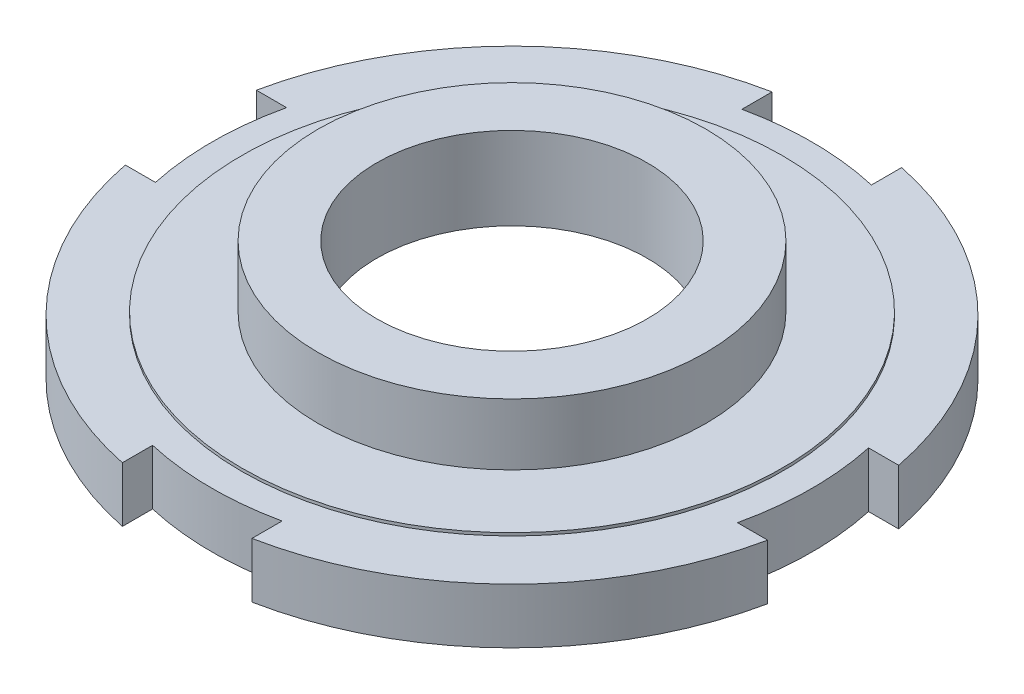
ISO-10303-21;
HEADER;
FILE_DESCRIPTION(('STEP AP214'),'2;1');
FILE_NAME('part.step','',(''),(''),'','','');
FILE_SCHEMA(('AUTOMOTIVE_DESIGN { 1 0 10303 214 1 1 1 1 }'));
ENDSEC;
DATA;
#1=APPLICATION_CONTEXT('core data for automotive mechanical design processes');
#2=APPLICATION_PROTOCOL_DEFINITION('international standard','automotive_design',2000,#1);
#3=PRODUCT_CONTEXT('',#1,'mechanical');
#4=PRODUCT('Part','Part','',(#3));
#5=PRODUCT_RELATED_PRODUCT_CATEGORY('part','',(#4));
#6=PRODUCT_DEFINITION_FORMATION('','',#4);
#7=PRODUCT_DEFINITION_CONTEXT('part definition',#1,'design');
#8=PRODUCT_DEFINITION('design','',#6,#7);
#9=PRODUCT_DEFINITION_SHAPE('','',#8);
#10=(LENGTH_UNIT() NAMED_UNIT(*) SI_UNIT(.MILLI.,.METRE.));
#11=(NAMED_UNIT(*) PLANE_ANGLE_UNIT() SI_UNIT($,.RADIAN.));
#12=(NAMED_UNIT(*) SI_UNIT($,.STERADIAN.) SOLID_ANGLE_UNIT());
#13=UNCERTAINTY_MEASURE_WITH_UNIT(LENGTH_MEASURE(1.E-05),#10,'distance_accuracy_value','');
#14=(GEOMETRIC_REPRESENTATION_CONTEXT(3) GLOBAL_UNCERTAINTY_ASSIGNED_CONTEXT((#13)) GLOBAL_UNIT_ASSIGNED_CONTEXT((#10,
#11,#12)) REPRESENTATION_CONTEXT('',''));
#15=CARTESIAN_POINT('',(0.,0.,0.));
#16=DIRECTION('',(0.,0.,1.));
#17=DIRECTION('',(1.,0.,0.));
#18=AXIS2_PLACEMENT_3D('',#15,#16,#17);
#19=CARTESIAN_POINT('',(0.,6.0000007,0.));
#20=DIRECTION('',(0.,1.,0.));
#21=DIRECTION('',(0.,0.,1.));
#22=AXIS2_PLACEMENT_3D('',#19,#20,#21);
#23=PLANE('',#22);
#24=CARTESIAN_POINT('',(0.,6.0000007,0.));
#25=DIRECTION('',(0.,1.,0.));
#26=DIRECTION('',(0.,0.,1.));
#27=AXIS2_PLACEMENT_3D('',#24,#25,#26);
#28=CIRCLE('',#27,20.01);
#29=CARTESIAN_POINT('',(0.,6.0000007,20.01));
#30=VERTEX_POINT('',#29);
#31=EDGE_CURVE('E346',#30,#30,#28,.T.);
#32=ORIENTED_EDGE('',*,*,#31,.F.);
#33=EDGE_LOOP('',(#32));
#34=FACE_BOUND('',#33,.T.);
#35=CARTESIAN_POINT('',(0.,6.0000007,0.));
#36=DIRECTION('',(0.,1.,0.));
#37=DIRECTION('',(0.,0.,1.));
#38=AXIS2_PLACEMENT_3D('',#35,#36,#37);
#39=CIRCLE('',#38,27.94);
#40=CARTESIAN_POINT('',(0.,6.0000007,27.94));
#41=VERTEX_POINT('',#40);
#42=EDGE_CURVE('E406',#41,#41,#39,.T.);
#43=ORIENTED_EDGE('',*,*,#42,.T.);
#44=EDGE_LOOP('',(#43));
#45=FACE_BOUND('',#44,.T.);
#46=ADVANCED_FACE('F36',(#34,#45),#23,.T.);
#47=CARTESIAN_POINT('',(0.,6.0000007,0.));
#48=DIRECTION('',(0.,-1.,0.));
#49=DIRECTION('',(0.,0.,-1.));
#50=AXIS2_PLACEMENT_3D('',#47,#48,#49);
#51=CYLINDRICAL_SURFACE('',#50,30.988);
#52=CARTESIAN_POINT('',(0.,5.7000007,0.));
#53=DIRECTION('',(0.,1.,0.));
#54=DIRECTION('',(0.,0.,1.));
#55=AXIS2_PLACEMENT_3D('',#52,#53,#54);
#56=CIRCLE('',#55,30.988);
#57=CARTESIAN_POINT('',(30.2051151586946,5.7000007,6.9215));
#58=VERTEX_POINT('',#57);
#59=CARTESIAN_POINT('',(30.2898993684363,5.7000007,-6.5405));
#60=VERTEX_POINT('',#59);
#61=EDGE_CURVE('E184',#58,#60,#56,.T.);
#62=ORIENTED_EDGE('',*,*,#61,.F.);
#63=DIRECTION('',(0.,-1.,0.));
#64=VECTOR('',#63,1.);
#65=CARTESIAN_POINT('',(30.2051151586946,6.0000007,6.9215));
#66=LINE('',#65,#64);
#67=CARTESIAN_POINT('',(30.2051151586946,0.,6.9215));
#68=VERTEX_POINT('',#67);
#69=EDGE_CURVE('E192',#58,#68,#66,.T.);
#70=ORIENTED_EDGE('',*,*,#69,.T.);
#71=CARTESIAN_POINT('',(0.,0.,0.));
#72=DIRECTION('',(0.,1.,0.));
#73=DIRECTION('',(0.,0.,1.));
#74=AXIS2_PLACEMENT_3D('',#71,#72,#73);
#75=CIRCLE('',#74,30.988);
#76=CARTESIAN_POINT('',(30.2898993684363,0.,-6.5405));
#77=VERTEX_POINT('',#76);
#78=EDGE_CURVE('E285',#68,#77,#75,.T.);
#79=ORIENTED_EDGE('',*,*,#78,.T.);
#80=DIRECTION('',(0.,-1.,0.));
#81=VECTOR('',#80,1.);
#82=CARTESIAN_POINT('',(30.2898993684363,6.0000007,-6.5405));
#83=LINE('',#82,#81);
#84=EDGE_CURVE('E194',#60,#77,#83,.T.);
#85=ORIENTED_EDGE('',*,*,#84,.F.);
#86=EDGE_LOOP('',(#62,#70,#79,#85));
#87=FACE_BOUND('',#86,.T.);
#88=ADVANCED_FACE('F38',(#87),#51,.T.);
#89=CARTESIAN_POINT('',(30.2898993684363,6.0000007,-6.5405));
#90=DIRECTION('',(0.,0.,-1.));
#91=DIRECTION('',(-1.,0.,0.));
#92=AXIS2_PLACEMENT_3D('',#89,#90,#91);
#93=PLANE('',#92);
#94=DIRECTION('',(1.,0.,0.));
#95=VECTOR('',#94,1.);
#96=CARTESIAN_POINT('',(30.2898993684363,5.7000007,-6.5405));
#97=LINE('',#96,#95);
#98=CARTESIAN_POINT('',(33.4016639667847,5.7000007,-6.5405));
#99=VERTEX_POINT('',#98);
#100=EDGE_CURVE('E196',#60,#99,#97,.T.);
#101=ORIENTED_EDGE('',*,*,#100,.F.);
#102=ORIENTED_EDGE('',*,*,#84,.T.);
#103=DIRECTION('',(1.,0.,0.));
#104=VECTOR('',#103,1.);
#105=CARTESIAN_POINT('',(30.2898993684363,0.,-6.5405));
#106=LINE('',#105,#104);
#107=CARTESIAN_POINT('',(33.4016639667847,0.,-6.5405));
#108=VERTEX_POINT('',#107);
#109=EDGE_CURVE('E287',#77,#108,#106,.T.);
#110=ORIENTED_EDGE('',*,*,#109,.T.);
#111=DIRECTION('',(0.,-1.,0.));
#112=VECTOR('',#111,1.);
#113=CARTESIAN_POINT('',(33.4016639667847,6.0000007,-6.5405));
#114=LINE('',#113,#112);
#115=EDGE_CURVE('E233',#99,#108,#114,.T.);
#116=ORIENTED_EDGE('',*,*,#115,.F.);
#117=EDGE_LOOP('',(#101,#102,#110,#116));
#118=FACE_BOUND('',#117,.T.);
#119=ADVANCED_FACE('F336',(#118),#93,.F.);
#120=CARTESIAN_POINT('',(0.,6.0000007,0.));
#121=DIRECTION('',(0.,-1.,0.));
#122=DIRECTION('',(0.,0.,-1.));
#123=AXIS2_PLACEMENT_3D('',#120,#121,#122);
#124=CYLINDRICAL_SURFACE('',#123,34.036);
#125=CARTESIAN_POINT('',(0.,5.7000007,0.));
#126=DIRECTION('',(0.,1.,0.));
#127=DIRECTION('',(0.,0.,1.));
#128=AXIS2_PLACEMENT_3D('',#125,#126,#127);
#129=CIRCLE('',#128,34.036);
#130=CARTESIAN_POINT('',(6.92149999999999,5.7000007,-33.3247975800304));
#131=VERTEX_POINT('',#130);
#132=EDGE_CURVE('E338',#99,#131,#129,.T.);
#133=ORIENTED_EDGE('',*,*,#132,.F.);
#134=ORIENTED_EDGE('',*,*,#115,.T.);
#135=CARTESIAN_POINT('',(0.,0.,0.));
#136=DIRECTION('',(0.,1.,0.));
#137=DIRECTION('',(0.,0.,1.));
#138=AXIS2_PLACEMENT_3D('',#135,#136,#137);
#139=CIRCLE('',#138,34.036);
#140=CARTESIAN_POINT('',(6.92149999999999,0.,-33.3247975800304));
#141=VERTEX_POINT('',#140);
#142=EDGE_CURVE('E290',#108,#141,#139,.T.);
#143=ORIENTED_EDGE('',*,*,#142,.T.);
#144=DIRECTION('',(0.,-1.,0.));
#145=VECTOR('',#144,1.);
#146=CARTESIAN_POINT('',(6.92149999999999,6.0000007,-33.3247975800304));
#147=LINE('',#146,#145);
#148=EDGE_CURVE('E231',#131,#141,#147,.T.);
#149=ORIENTED_EDGE('',*,*,#148,.F.);
#150=EDGE_LOOP('',(#133,#134,#143,#149));
#151=FACE_BOUND('',#150,.T.);
#152=ADVANCED_FACE('F380',(#151),#124,.T.);
#153=CARTESIAN_POINT('',(6.92149999999999,6.0000007,-30.2051151586946));
#154=DIRECTION('',(1.,0.,0.));
#155=DIRECTION('',(0.,0.,-1.));
#156=AXIS2_PLACEMENT_3D('',#153,#154,#155);
#157=PLANE('',#156);
#158=DIRECTION('',(0.,0.,1.));
#159=VECTOR('',#158,1.);
#160=CARTESIAN_POINT('',(6.92149999999999,5.7000007,-30.2051151586946));
#161=LINE('',#160,#159);
#162=CARTESIAN_POINT('',(6.92149999999999,5.7000007,-30.2051151586946));
#163=VERTEX_POINT('',#162);
#164=EDGE_CURVE('E340',#131,#163,#161,.T.);
#165=ORIENTED_EDGE('',*,*,#164,.F.);
#166=ORIENTED_EDGE('',*,*,#148,.T.);
#167=DIRECTION('',(0.,0.,1.));
#168=VECTOR('',#167,1.);
#169=CARTESIAN_POINT('',(6.92149999999999,0.,-30.2051151586946));
#170=LINE('',#169,#168);
#171=CARTESIAN_POINT('',(6.92149999999999,0.,-30.2051151586946));
#172=VERTEX_POINT('',#171);
#173=EDGE_CURVE('E293',#141,#172,#170,.T.);
#174=ORIENTED_EDGE('',*,*,#173,.T.);
#175=DIRECTION('',(0.,-1.,0.));
#176=VECTOR('',#175,1.);
#177=CARTESIAN_POINT('',(6.92149999999999,6.0000007,-30.2051151586946));
#178=LINE('',#177,#176);
#179=EDGE_CURVE('E229',#163,#172,#178,.T.);
#180=ORIENTED_EDGE('',*,*,#179,.F.);
#181=EDGE_LOOP('',(#165,#166,#174,#180));
#182=FACE_BOUND('',#181,.T.);
#183=ADVANCED_FACE('F377',(#182),#157,.F.);
#184=CARTESIAN_POINT('',(0.,6.0000007,0.));
#185=DIRECTION('',(0.,-1.,0.));
#186=DIRECTION('',(0.,0.,-1.));
#187=AXIS2_PLACEMENT_3D('',#184,#185,#186);
#188=CYLINDRICAL_SURFACE('',#187,30.988);
#189=CARTESIAN_POINT('',(0.,5.7000007,0.));
#190=DIRECTION('',(0.,1.,0.));
#191=DIRECTION('',(0.,0.,1.));
#192=AXIS2_PLACEMENT_3D('',#189,#190,#191);
#193=CIRCLE('',#192,30.988);
#194=CARTESIAN_POINT('',(-6.54050000000001,5.7000007,-30.2898993684363));
#195=VERTEX_POINT('',#194);
#196=EDGE_CURVE('E381',#163,#195,#193,.T.);
#197=ORIENTED_EDGE('',*,*,#196,.F.);
#198=ORIENTED_EDGE('',*,*,#179,.T.);
#199=CARTESIAN_POINT('',(0.,0.,0.));
#200=DIRECTION('',(0.,1.,0.));
#201=DIRECTION('',(0.,0.,1.));
#202=AXIS2_PLACEMENT_3D('',#199,#200,#201);
#203=CIRCLE('',#202,30.988);
#204=CARTESIAN_POINT('',(5.57076323728412,0.,-30.4831550360871));
#205=VERTEX_POINT('',#204);
#206=EDGE_CURVE('E296',#172,#205,#203,.T.);
#207=ORIENTED_EDGE('',*,*,#206,.T.);
#208=DIRECTION('',(0.,-1.,0.));
#209=VECTOR('',#208,1.);
#210=CARTESIAN_POINT('',(5.57076323728412,6.0000007,-30.4831550360871));
#211=LINE('',#210,#209);
#212=CARTESIAN_POINT('',(5.57076323728412,3.81,-30.4831550360871));
#213=VERTEX_POINT('',#212);
#214=EDGE_CURVE('E244',#205,#213,#211,.F.);
#215=ORIENTED_EDGE('',*,*,#214,.T.);
#216=CARTESIAN_POINT('',(0.,3.81,0.));
#217=DIRECTION('',(0.,1.,0.));
#218=DIRECTION('',(0.,0.,1.));
#219=AXIS2_PLACEMENT_3D('',#216,#217,#218);
#220=CIRCLE('',#219,30.988);
#221=CARTESIAN_POINT('',(0.887216196559503,3.81,-30.975296470261));
#222=VERTEX_POINT('',#221);
#223=EDGE_CURVE('E240',#213,#222,#220,.T.);
#224=ORIENTED_EDGE('',*,*,#223,.T.);
#225=DIRECTION('',(0.,-1.,0.));
#226=VECTOR('',#225,1.);
#227=CARTESIAN_POINT('',(0.887216196559503,6.0000007,-30.975296470261));
#228=LINE('',#227,#226);
#229=CARTESIAN_POINT('',(0.887216196559503,0.,-30.975296470261));
#230=VERTEX_POINT('',#229);
#231=EDGE_CURVE('E236',#222,#230,#228,.T.);
#232=ORIENTED_EDGE('',*,*,#231,.T.);
#233=CARTESIAN_POINT('',(-6.5405,0.,-30.2898993684363));
#234=VERTEX_POINT('',#233);
#235=EDGE_CURVE('E266',#230,#234,#203,.T.);
#236=ORIENTED_EDGE('',*,*,#235,.T.);
#237=DIRECTION('',(0.,-1.,0.));
#238=VECTOR('',#237,1.);
#239=CARTESIAN_POINT('',(-6.5405,6.0000007,-30.2898993684363));
#240=LINE('',#239,#238);
#241=EDGE_CURVE('E227',#195,#234,#240,.T.);
#242=ORIENTED_EDGE('',*,*,#241,.F.);
#243=EDGE_LOOP('',(#197,#198,#207,#215,#224,#232,#236,#242));
#244=FACE_BOUND('',#243,.T.);
#245=ADVANCED_FACE('F372',(#244),#188,.T.);
#246=CARTESIAN_POINT('',(-6.54050000000001,6.0000007,-30.2898993684363));
#247=DIRECTION('',(-1.,0.,0.));
#248=DIRECTION('',(0.,0.,1.));
#249=AXIS2_PLACEMENT_3D('',#246,#247,#248);
#250=PLANE('',#249);
#251=DIRECTION('',(0.,0.,-1.));
#252=VECTOR('',#251,1.);
#253=CARTESIAN_POINT('',(-6.54050000000001,5.7000007,-30.2898993684363));
#254=LINE('',#253,#252);
#255=CARTESIAN_POINT('',(-6.54050000000001,5.7000007,-33.4016639667847));
#256=VERTEX_POINT('',#255);
#257=EDGE_CURVE('E384',#195,#256,#254,.T.);
#258=ORIENTED_EDGE('',*,*,#257,.F.);
#259=ORIENTED_EDGE('',*,*,#241,.T.);
#260=DIRECTION('',(0.,0.,-1.));
#261=VECTOR('',#260,1.);
#262=CARTESIAN_POINT('',(-6.54050000000001,0.,-30.2898993684363));
#263=LINE('',#262,#261);
#264=CARTESIAN_POINT('',(-6.54050000000001,0.,-33.4016639667847));
#265=VERTEX_POINT('',#264);
#266=EDGE_CURVE('E299',#234,#265,#263,.T.);
#267=ORIENTED_EDGE('',*,*,#266,.T.);
#268=DIRECTION('',(0.,-1.,0.));
#269=VECTOR('',#268,1.);
#270=CARTESIAN_POINT('',(-6.54050000000001,6.0000007,-33.4016639667847));
#271=LINE('',#270,#269);
#272=EDGE_CURVE('E225',#256,#265,#271,.T.);
#273=ORIENTED_EDGE('',*,*,#272,.F.);
#274=EDGE_LOOP('',(#258,#259,#267,#273));
#275=FACE_BOUND('',#274,.T.);
#276=ADVANCED_FACE('F476',(#275),#250,.F.);
#277=CARTESIAN_POINT('',(0.,6.0000007,0.));
#278=DIRECTION('',(0.,-1.,0.));
#279=DIRECTION('',(0.,0.,-1.));
#280=AXIS2_PLACEMENT_3D('',#277,#278,#279);
#281=CYLINDRICAL_SURFACE('',#280,34.036);
#282=CARTESIAN_POINT('',(0.,5.7000007,0.));
#283=DIRECTION('',(0.,1.,0.));
#284=DIRECTION('',(0.,0.,1.));
#285=AXIS2_PLACEMENT_3D('',#282,#283,#284);
#286=CIRCLE('',#285,34.036);
#287=CARTESIAN_POINT('',(-33.3247975800304,5.7000007,-6.9215));
#288=VERTEX_POINT('',#287);
#289=EDGE_CURVE('E386',#256,#288,#286,.T.);
#290=ORIENTED_EDGE('',*,*,#289,.F.);
#291=ORIENTED_EDGE('',*,*,#272,.T.);
#292=CARTESIAN_POINT('',(0.,0.,0.));
#293=DIRECTION('',(0.,1.,0.));
#294=DIRECTION('',(0.,0.,1.));
#295=AXIS2_PLACEMENT_3D('',#292,#293,#294);
#296=CIRCLE('',#295,34.036);
#297=CARTESIAN_POINT('',(-33.3247975800304,0.,-6.92150000000002));
#298=VERTEX_POINT('',#297);
#299=EDGE_CURVE('E302',#265,#298,#296,.T.);
#300=ORIENTED_EDGE('',*,*,#299,.T.);
#301=DIRECTION('',(0.,-1.,0.));
#302=VECTOR('',#301,1.);
#303=CARTESIAN_POINT('',(-33.3247975800304,6.0000007,-6.92150000000002));
#304=LINE('',#303,#302);
#305=EDGE_CURVE('E223',#288,#298,#304,.T.);
#306=ORIENTED_EDGE('',*,*,#305,.F.);
#307=EDGE_LOOP('',(#290,#291,#300,#306));
#308=FACE_BOUND('',#307,.T.);
#309=ADVANCED_FACE('F472',(#308),#281,.T.);
#310=CARTESIAN_POINT('',(-30.2051151586946,6.0000007,-6.92150000000001));
#311=DIRECTION('',(0.,0.,-1.));
#312=DIRECTION('',(-1.,0.,0.));
#313=AXIS2_PLACEMENT_3D('',#310,#311,#312);
#314=PLANE('',#313);
#315=DIRECTION('',(1.,0.,0.));
#316=VECTOR('',#315,1.);
#317=CARTESIAN_POINT('',(-30.2051151586946,5.7000007,-6.92150000000001));
#318=LINE('',#317,#316);
#319=CARTESIAN_POINT('',(-30.2051151586946,5.7000007,-6.92150000000001));
#320=VERTEX_POINT('',#319);
#321=EDGE_CURVE('E390',#288,#320,#318,.T.);
#322=ORIENTED_EDGE('',*,*,#321,.F.);
#323=ORIENTED_EDGE('',*,*,#305,.T.);
#324=DIRECTION('',(1.,0.,0.));
#325=VECTOR('',#324,1.);
#326=CARTESIAN_POINT('',(-30.2051151586946,0.,-6.92150000000001));
#327=LINE('',#326,#325);
#328=CARTESIAN_POINT('',(-30.2051151586946,0.,-6.92150000000001));
#329=VERTEX_POINT('',#328);
#330=EDGE_CURVE('E305',#298,#329,#327,.T.);
#331=ORIENTED_EDGE('',*,*,#330,.T.);
#332=DIRECTION('',(0.,-1.,0.));
#333=VECTOR('',#332,1.);
#334=CARTESIAN_POINT('',(-30.2051151586946,6.0000007,-6.92150000000001));
#335=LINE('',#334,#333);
#336=EDGE_CURVE('E221',#320,#329,#335,.T.);
#337=ORIENTED_EDGE('',*,*,#336,.F.);
#338=EDGE_LOOP('',(#322,#323,#331,#337));
#339=FACE_BOUND('',#338,.T.);
#340=ADVANCED_FACE('F468',(#339),#314,.F.);
#341=CARTESIAN_POINT('',(0.,6.0000007,0.));
#342=DIRECTION('',(0.,-1.,0.));
#343=DIRECTION('',(0.,0.,-1.));
#344=AXIS2_PLACEMENT_3D('',#341,#342,#343);
#345=CYLINDRICAL_SURFACE('',#344,30.988);
#346=CARTESIAN_POINT('',(0.,5.7000007,0.));
#347=DIRECTION('',(0.,1.,0.));
#348=DIRECTION('',(0.,0.,1.));
#349=AXIS2_PLACEMENT_3D('',#346,#347,#348);
#350=CIRCLE('',#349,30.988);
#351=CARTESIAN_POINT('',(-30.2898993684363,5.7000007,6.5405));
#352=VERTEX_POINT('',#351);
#353=EDGE_CURVE('E392',#320,#352,#350,.T.);
#354=ORIENTED_EDGE('',*,*,#353,.F.);
#355=ORIENTED_EDGE('',*,*,#336,.T.);
#356=CARTESIAN_POINT('',(0.,0.,0.));
#357=DIRECTION('',(0.,1.,0.));
#358=DIRECTION('',(0.,0.,1.));
#359=AXIS2_PLACEMENT_3D('',#356,#357,#358);
#360=CIRCLE('',#359,30.988);
#361=CARTESIAN_POINT('',(-30.2898993684363,0.,6.5405));
#362=VERTEX_POINT('',#361);
#363=EDGE_CURVE('E308',#329,#362,#360,.T.);
#364=ORIENTED_EDGE('',*,*,#363,.T.);
#365=DIRECTION('',(0.,-1.,0.));
#366=VECTOR('',#365,1.);
#367=CARTESIAN_POINT('',(-30.2898993684363,6.0000007,6.5405));
#368=LINE('',#367,#366);
#369=EDGE_CURVE('E219',#352,#362,#368,.T.);
#370=ORIENTED_EDGE('',*,*,#369,.F.);
#371=EDGE_LOOP('',(#354,#355,#364,#370));
#372=FACE_BOUND('',#371,.T.);
#373=ADVANCED_FACE('F464',(#372),#345,.T.);
#374=CARTESIAN_POINT('',(-30.2898993684363,6.0000007,6.5405));
#375=DIRECTION('',(0.,0.,1.));
#376=DIRECTION('',(1.,0.,0.));
#377=AXIS2_PLACEMENT_3D('',#374,#375,#376);
#378=PLANE('',#377);
#379=DIRECTION('',(-1.,0.,0.));
#380=VECTOR('',#379,1.);
#381=CARTESIAN_POINT('',(-30.2898993684363,5.7000007,6.5405));
#382=LINE('',#381,#380);
#383=CARTESIAN_POINT('',(-33.4016639667847,5.7000007,6.5405));
#384=VERTEX_POINT('',#383);
#385=EDGE_CURVE('E394',#352,#384,#382,.T.);
#386=ORIENTED_EDGE('',*,*,#385,.F.);
#387=ORIENTED_EDGE('',*,*,#369,.T.);
#388=DIRECTION('',(-1.,0.,0.));
#389=VECTOR('',#388,1.);
#390=CARTESIAN_POINT('',(-30.2898993684363,0.,6.5405));
#391=LINE('',#390,#389);
#392=CARTESIAN_POINT('',(-33.4016639667847,0.,6.5405));
#393=VERTEX_POINT('',#392);
#394=EDGE_CURVE('E311',#362,#393,#391,.T.);
#395=ORIENTED_EDGE('',*,*,#394,.T.);
#396=DIRECTION('',(0.,-1.,0.));
#397=VECTOR('',#396,1.);
#398=CARTESIAN_POINT('',(-33.4016639667847,6.0000007,6.5405));
#399=LINE('',#398,#397);
#400=EDGE_CURVE('E217',#384,#393,#399,.T.);
#401=ORIENTED_EDGE('',*,*,#400,.F.);
#402=EDGE_LOOP('',(#386,#387,#395,#401));
#403=FACE_BOUND('',#402,.T.);
#404=ADVANCED_FACE('F460',(#403),#378,.F.);
#405=CARTESIAN_POINT('',(0.,6.0000007,0.));
#406=DIRECTION('',(0.,-1.,0.));
#407=DIRECTION('',(0.,0.,-1.));
#408=AXIS2_PLACEMENT_3D('',#405,#406,#407);
#409=CYLINDRICAL_SURFACE('',#408,34.036);
#410=CARTESIAN_POINT('',(0.,5.7000007,0.));
#411=DIRECTION('',(0.,1.,0.));
#412=DIRECTION('',(0.,0.,1.));
#413=AXIS2_PLACEMENT_3D('',#410,#411,#412);
#414=CIRCLE('',#413,34.036);
#415=CARTESIAN_POINT('',(-6.9215,5.7000007,33.3247975800304));
#416=VERTEX_POINT('',#415);
#417=EDGE_CURVE('E396',#384,#416,#414,.T.);
#418=ORIENTED_EDGE('',*,*,#417,.F.);
#419=ORIENTED_EDGE('',*,*,#400,.T.);
#420=CARTESIAN_POINT('',(0.,0.,0.));
#421=DIRECTION('',(0.,1.,0.));
#422=DIRECTION('',(0.,0.,1.));
#423=AXIS2_PLACEMENT_3D('',#420,#421,#422);
#424=CIRCLE('',#423,34.036);
#425=CARTESIAN_POINT('',(-6.92150000000002,0.,33.3247975800304));
#426=VERTEX_POINT('',#425);
#427=EDGE_CURVE('E314',#393,#426,#424,.T.);
#428=ORIENTED_EDGE('',*,*,#427,.T.);
#429=DIRECTION('',(0.,-1.,0.));
#430=VECTOR('',#429,1.);
#431=CARTESIAN_POINT('',(-6.92150000000002,6.0000007,33.3247975800304));
#432=LINE('',#431,#430);
#433=EDGE_CURVE('E215',#416,#426,#432,.T.);
#434=ORIENTED_EDGE('',*,*,#433,.F.);
#435=EDGE_LOOP('',(#418,#419,#428,#434));
#436=FACE_BOUND('',#435,.T.);
#437=ADVANCED_FACE('F456',(#436),#409,.T.);
#438=CARTESIAN_POINT('',(-6.9215,6.0000007,30.2051151586946));
#439=DIRECTION('',(-1.,0.,0.));
#440=DIRECTION('',(0.,0.,1.));
#441=AXIS2_PLACEMENT_3D('',#438,#439,#440);
#442=PLANE('',#441);
#443=DIRECTION('',(0.,0.,-1.));
#444=VECTOR('',#443,1.);
#445=CARTESIAN_POINT('',(-6.9215,5.7000007,30.2051151586946));
#446=LINE('',#445,#444);
#447=CARTESIAN_POINT('',(-6.9215,5.7000007,30.2051151586946));
#448=VERTEX_POINT('',#447);
#449=EDGE_CURVE('E398',#416,#448,#446,.T.);
#450=ORIENTED_EDGE('',*,*,#449,.F.);
#451=ORIENTED_EDGE('',*,*,#433,.T.);
#452=DIRECTION('',(0.,0.,-1.));
#453=VECTOR('',#452,1.);
#454=CARTESIAN_POINT('',(-6.9215,0.,30.2051151586946));
#455=LINE('',#454,#453);
#456=CARTESIAN_POINT('',(-6.9215,0.,30.2051151586946));
#457=VERTEX_POINT('',#456);
#458=EDGE_CURVE('E317',#426,#457,#455,.T.);
#459=ORIENTED_EDGE('',*,*,#458,.T.);
#460=DIRECTION('',(0.,-1.,0.));
#461=VECTOR('',#460,1.);
#462=CARTESIAN_POINT('',(-6.9215,6.0000007,30.2051151586946));
#463=LINE('',#462,#461);
#464=EDGE_CURVE('E213',#448,#457,#463,.T.);
#465=ORIENTED_EDGE('',*,*,#464,.F.);
#466=EDGE_LOOP('',(#450,#451,#459,#465));
#467=FACE_BOUND('',#466,.T.);
#468=ADVANCED_FACE('F452',(#467),#442,.F.);
#469=CARTESIAN_POINT('',(0.,6.0000007,0.));
#470=DIRECTION('',(0.,-1.,0.));
#471=DIRECTION('',(0.,0.,-1.));
#472=AXIS2_PLACEMENT_3D('',#469,#470,#471);
#473=CYLINDRICAL_SURFACE('',#472,30.988);
#474=CARTESIAN_POINT('',(0.,5.7000007,0.));
#475=DIRECTION('',(0.,1.,0.));
#476=DIRECTION('',(0.,0.,1.));
#477=AXIS2_PLACEMENT_3D('',#474,#475,#476);
#478=CIRCLE('',#477,30.988);
#479=CARTESIAN_POINT('',(6.5405,5.7000007,30.2898993684363));
#480=VERTEX_POINT('',#479);
#481=EDGE_CURVE('E400',#448,#480,#478,.T.);
#482=ORIENTED_EDGE('',*,*,#481,.F.);
#483=ORIENTED_EDGE('',*,*,#464,.T.);
#484=CARTESIAN_POINT('',(0.,0.,0.));
#485=DIRECTION('',(0.,1.,0.));
#486=DIRECTION('',(0.,0.,1.));
#487=AXIS2_PLACEMENT_3D('',#484,#485,#486);
#488=CIRCLE('',#487,30.988);
#489=CARTESIAN_POINT('',(6.5405,0.,30.2898993684363));
#490=VERTEX_POINT('',#489);
#491=EDGE_CURVE('E320',#457,#490,#488,.T.);
#492=ORIENTED_EDGE('',*,*,#491,.T.);
#493=DIRECTION('',(0.,-1.,0.));
#494=VECTOR('',#493,1.);
#495=CARTESIAN_POINT('',(6.5405,6.0000007,30.2898993684363));
#496=LINE('',#495,#494);
#497=EDGE_CURVE('E211',#480,#490,#496,.T.);
#498=ORIENTED_EDGE('',*,*,#497,.F.);
#499=EDGE_LOOP('',(#482,#483,#492,#498));
#500=FACE_BOUND('',#499,.T.);
#501=ADVANCED_FACE('F448',(#500),#473,.T.);
#502=CARTESIAN_POINT('',(6.5405,6.0000007,30.2898993684363));
#503=DIRECTION('',(1.,0.,0.));
#504=DIRECTION('',(0.,0.,-1.));
#505=AXIS2_PLACEMENT_3D('',#502,#503,#504);
#506=PLANE('',#505);
#507=DIRECTION('',(0.,0.,1.));
#508=VECTOR('',#507,1.);
#509=CARTESIAN_POINT('',(6.5405,5.7000007,30.2898993684363));
#510=LINE('',#509,#508);
#511=CARTESIAN_POINT('',(6.54050000000001,5.7000007,33.4016639667847));
#512=VERTEX_POINT('',#511);
#513=EDGE_CURVE('E402',#480,#512,#510,.T.);
#514=ORIENTED_EDGE('',*,*,#513,.F.);
#515=ORIENTED_EDGE('',*,*,#497,.T.);
#516=DIRECTION('',(0.,0.,1.));
#517=VECTOR('',#516,1.);
#518=CARTESIAN_POINT('',(6.5405,0.,30.2898993684363));
#519=LINE('',#518,#517);
#520=CARTESIAN_POINT('',(6.5405,0.,33.4016639667847));
#521=VERTEX_POINT('',#520);
#522=EDGE_CURVE('E323',#490,#521,#519,.T.);
#523=ORIENTED_EDGE('',*,*,#522,.T.);
#524=DIRECTION('',(0.,-1.,0.));
#525=VECTOR('',#524,1.);
#526=CARTESIAN_POINT('',(6.5405,6.0000007,33.4016639667847));
#527=LINE('',#526,#525);
#528=EDGE_CURVE('E204',#512,#521,#527,.T.);
#529=ORIENTED_EDGE('',*,*,#528,.F.);
#530=EDGE_LOOP('',(#514,#515,#523,#529));
#531=FACE_BOUND('',#530,.T.);
#532=ADVANCED_FACE('F445',(#531),#506,.F.);
#533=CARTESIAN_POINT('',(0.,6.0000007,0.));
#534=DIRECTION('',(0.,-1.,0.));
#535=DIRECTION('',(0.,0.,-1.));
#536=AXIS2_PLACEMENT_3D('',#533,#534,#535);
#537=CYLINDRICAL_SURFACE('',#536,34.036);
#538=CARTESIAN_POINT('',(0.,5.7000007,0.));
#539=DIRECTION('',(0.,1.,0.));
#540=DIRECTION('',(0.,0.,1.));
#541=AXIS2_PLACEMENT_3D('',#538,#539,#540);
#542=CIRCLE('',#541,34.036);
#543=CARTESIAN_POINT('',(33.3247975800304,5.7000007,6.9215));
#544=VERTEX_POINT('',#543);
#545=EDGE_CURVE('E50',#512,#544,#542,.T.);
#546=ORIENTED_EDGE('',*,*,#545,.F.);
#547=ORIENTED_EDGE('',*,*,#528,.T.);
#548=CARTESIAN_POINT('',(0.,0.,0.));
#549=DIRECTION('',(0.,1.,0.));
#550=DIRECTION('',(0.,0.,1.));
#551=AXIS2_PLACEMENT_3D('',#548,#549,#550);
#552=CIRCLE('',#551,34.036);
#553=CARTESIAN_POINT('',(33.3247975800304,0.,6.9215));
#554=VERTEX_POINT('',#553);
#555=EDGE_CURVE('E206',#521,#554,#552,.T.);
#556=ORIENTED_EDGE('',*,*,#555,.T.);
#557=DIRECTION('',(0.,-1.,0.));
#558=VECTOR('',#557,1.);
#559=CARTESIAN_POINT('',(33.3247975800304,6.0000007,6.9215));
#560=LINE('',#559,#558);
#561=EDGE_CURVE('E202',#544,#554,#560,.T.);
#562=ORIENTED_EDGE('',*,*,#561,.F.);
#563=EDGE_LOOP('',(#546,#547,#556,#562));
#564=FACE_BOUND('',#563,.T.);
#565=ADVANCED_FACE('F328',(#564),#537,.T.);
#566=CARTESIAN_POINT('',(30.2051151586946,6.0000007,6.9215));
#567=DIRECTION('',(0.,0.,1.));
#568=DIRECTION('',(1.,0.,0.));
#569=AXIS2_PLACEMENT_3D('',#566,#567,#568);
#570=PLANE('',#569);
#571=DIRECTION('',(-1.,0.,0.));
#572=VECTOR('',#571,1.);
#573=CARTESIAN_POINT('',(30.2051151586946,5.7000007,6.9215));
#574=LINE('',#573,#572);
#575=EDGE_CURVE('E11',#544,#58,#574,.T.);
#576=ORIENTED_EDGE('',*,*,#575,.F.);
#577=ORIENTED_EDGE('',*,*,#561,.T.);
#578=DIRECTION('',(-1.,0.,0.));
#579=VECTOR('',#578,1.);
#580=CARTESIAN_POINT('',(30.2051151586946,0.,6.9215));
#581=LINE('',#580,#579);
#582=EDGE_CURVE('E200',#554,#68,#581,.T.);
#583=ORIENTED_EDGE('',*,*,#582,.T.);
#584=ORIENTED_EDGE('',*,*,#69,.F.);
#585=EDGE_LOOP('',(#576,#577,#583,#584));
#586=FACE_BOUND('',#585,.T.);
#587=ADVANCED_FACE('F198',(#586),#570,.F.);
#588=CARTESIAN_POINT('',(0.,3.81,0.));
#589=DIRECTION('',(0.,-1.,0.));
#590=DIRECTION('',(0.,0.,-1.));
#591=AXIS2_PLACEMENT_3D('',#588,#589,#590);
#592=CYLINDRICAL_SURFACE('',#591,20.066);
#593=CARTESIAN_POINT('',(0.,0.3,0.));
#594=DIRECTION('',(0.,-1.,0.));
#595=DIRECTION('',(0.,0.,-1.));
#596=AXIS2_PLACEMENT_3D('',#593,#594,#595);
#597=CIRCLE('',#596,20.066);
#598=CARTESIAN_POINT('',(8.19621258604991,0.300000000000001,-18.3157433713261));
#599=VERTEX_POINT('',#598);
#600=CARTESIAN_POINT('',(17.3776657523386,0.3,-10.033));
#601=VERTEX_POINT('',#600);
#602=EDGE_CURVE('E247',#599,#601,#597,.F.);
#603=ORIENTED_EDGE('',*,*,#602,.F.);
#604=DIRECTION('',(0.,-1.,0.));
#605=VECTOR('',#604,1.);
#606=CARTESIAN_POINT('',(8.19621258604991,3.81,-18.3157433713261));
#607=LINE('',#606,#605);
#608=CARTESIAN_POINT('',(8.19621258604991,3.81,-18.3157433713261));
#609=VERTEX_POINT('',#608);
#610=EDGE_CURVE('E281',#609,#599,#607,.T.);
#611=ORIENTED_EDGE('',*,*,#610,.F.);
#612=CARTESIAN_POINT('',(0.,3.81,0.));
#613=DIRECTION('',(0.,-1.,0.));
#614=DIRECTION('',(0.,0.,1.));
#615=AXIS2_PLACEMENT_3D('',#612,#613,#614);
#616=CIRCLE('',#615,20.066);
#617=CARTESIAN_POINT('',(17.3776657523386,3.81,-10.033));
#618=VERTEX_POINT('',#617);
#619=EDGE_CURVE('E270',#618,#609,#616,.T.);
#620=ORIENTED_EDGE('',*,*,#619,.F.);
#621=DIRECTION('',(0.,-1.,0.));
#622=VECTOR('',#621,1.);
#623=CARTESIAN_POINT('',(17.3776657523386,3.81,-10.033));
#624=LINE('',#623,#622);
#625=EDGE_CURVE('E241',#618,#601,#624,.T.);
#626=ORIENTED_EDGE('',*,*,#625,.T.);
#627=EDGE_LOOP('',(#603,#611,#620,#626));
#628=FACE_BOUND('',#627,.T.);
#629=ADVANCED_FACE('F369',(#628),#592,.F.);
#630=CARTESIAN_POINT('',(0.,0.,0.));
#631=DIRECTION('',(0.,1.,0.));
#632=DIRECTION('',(0.,0.,1.));
#633=AXIS2_PLACEMENT_3D('',#630,#631,#632);
#634=PLANE('',#633);
#635=DIRECTION('',(-0.500000000000001,0.,-0.866025403784438));
#636=VECTOR('',#635,1.);
#637=CARTESIAN_POINT('',(-4.5396617454955,0.,-40.374924792375));
#638=LINE('',#637,#636);
#639=CARTESIAN_POINT('',(2.71604418677659,0.,-27.8076734729009));
#640=VERTEX_POINT('',#639);
#641=EDGE_CURVE('E253',#640,#230,#638,.T.);
#642=ORIENTED_EDGE('',*,*,#641,.F.);
#643=CARTESIAN_POINT('',(0.,0.,0.));
#644=DIRECTION('',(0.,-1.,0.));
#645=DIRECTION('',(0.,0.,-1.));
#646=AXIS2_PLACEMENT_3D('',#643,#644,#645);
#647=CIRCLE('',#646,27.94);
#648=CARTESIAN_POINT('',(7.65656442584272,0.,-26.8704414030161));
#649=VERTEX_POINT('',#648);
#650=EDGE_CURVE('E262',#649,#640,#647,.T.);
#651=ORIENTED_EDGE('',*,*,#650,.F.);
#652=DIRECTION('',(0.499999999999999,0.,0.866025403784439));
#653=VECTOR('',#652,1.);
#654=CARTESIAN_POINT('',(17.3776657523386,0.,-10.033));
#655=LINE('',#654,#653);
#656=EDGE_CURVE('E267',#205,#649,#655,.T.);
#657=ORIENTED_EDGE('',*,*,#656,.F.);
#658=ORIENTED_EDGE('',*,*,#206,.F.);
#659=ORIENTED_EDGE('',*,*,#173,.F.);
#660=ORIENTED_EDGE('',*,*,#142,.F.);
#661=ORIENTED_EDGE('',*,*,#109,.F.);
#662=ORIENTED_EDGE('',*,*,#78,.F.);
#663=ORIENTED_EDGE('',*,*,#582,.F.);
#664=ORIENTED_EDGE('',*,*,#555,.F.);
#665=ORIENTED_EDGE('',*,*,#522,.F.);
#666=ORIENTED_EDGE('',*,*,#491,.F.);
#667=ORIENTED_EDGE('',*,*,#458,.F.);
#668=ORIENTED_EDGE('',*,*,#427,.F.);
#669=ORIENTED_EDGE('',*,*,#394,.F.);
#670=ORIENTED_EDGE('',*,*,#363,.F.);
#671=ORIENTED_EDGE('',*,*,#330,.F.);
#672=ORIENTED_EDGE('',*,*,#299,.F.);
#673=ORIENTED_EDGE('',*,*,#266,.F.);
#674=ORIENTED_EDGE('',*,*,#235,.F.);
#675=EDGE_LOOP('',(#642,#651,#657,#658,#659,#660,#661,#662,#663,#664,#665,#666,#667,#668,#669,
#670,#671,#672,#673,#674));
#676=FACE_BOUND('',#675,.T.);
#677=ADVANCED_FACE('F260',(#676),#634,.F.);
#678=CARTESIAN_POINT('',(0.,6.0000007,0.));
#679=DIRECTION('',(0.,-1.,0.));
#680=DIRECTION('',(0.,0.,-1.));
#681=AXIS2_PLACEMENT_3D('',#678,#679,#680);
#682=CYLINDRICAL_SURFACE('',#681,13.97);
#683=CARTESIAN_POINT('',(0.,3.81,0.));
#684=DIRECTION('',(0.,1.,0.));
#685=DIRECTION('',(0.,0.,1.));
#686=AXIS2_PLACEMENT_3D('',#683,#684,#685);
#687=CIRCLE('',#686,13.97);
#688=CARTESIAN_POINT('',(0.,3.81,13.97));
#689=VERTEX_POINT('',#688);
#690=EDGE_CURVE('E237',#689,#689,#687,.T.);
#691=ORIENTED_EDGE('',*,*,#690,.F.);
#692=EDGE_LOOP('',(#691));
#693=FACE_BOUND('',#692,.T.);
#694=CARTESIAN_POINT('',(0.,12.3500007,0.));
#695=DIRECTION('',(0.,1.,0.));
#696=DIRECTION('',(0.,0.,1.));
#697=AXIS2_PLACEMENT_3D('',#694,#695,#696);
#698=CIRCLE('',#697,13.97);
#699=CARTESIAN_POINT('',(0.,12.3500007,13.97));
#700=VERTEX_POINT('',#699);
#701=EDGE_CURVE('E195',#700,#700,#698,.T.);
#702=ORIENTED_EDGE('',*,*,#701,.T.);
#703=EDGE_LOOP('',(#702));
#704=FACE_BOUND('',#703,.T.);
#705=ADVANCED_FACE('F437',(#693,#704),#682,.F.);
#706=CARTESIAN_POINT('',(17.3776657523386,3.81,-10.033));
#707=DIRECTION('',(0.866025403784439,0.,-0.499999999999999));
#708=DIRECTION('',(-0.499999999999999,0.,-0.866025403784439));
#709=AXIS2_PLACEMENT_3D('',#706,#707,#708);
#710=PLANE('',#709);
#711=ORIENTED_EDGE('',*,*,#656,.T.);
#712=DIRECTION('',(0.,-1.,0.));
#713=VECTOR('',#712,1.);
#714=CARTESIAN_POINT('',(7.65656442584272,0.3,-26.8704414030161));
#715=LINE('',#714,#713);
#716=CARTESIAN_POINT('',(7.65656442584272,0.3,-26.8704414030161));
#717=VERTEX_POINT('',#716);
#718=EDGE_CURVE('E268',#649,#717,#715,.F.);
#719=ORIENTED_EDGE('',*,*,#718,.T.);
#720=DIRECTION('',(-0.499999999999999,0.,-0.866025403784439));
#721=VECTOR('',#720,1.);
#722=CARTESIAN_POINT('',(17.3776657523386,0.3,-10.033));
#723=LINE('',#722,#721);
#724=EDGE_CURVE('E273',#601,#717,#723,.T.);
#725=ORIENTED_EDGE('',*,*,#724,.F.);
#726=ORIENTED_EDGE('',*,*,#625,.F.);
#727=DIRECTION('',(0.499999999999999,0.,0.866025403784439));
#728=VECTOR('',#727,1.);
#729=CARTESIAN_POINT('',(17.3776657523386,3.81,-10.033));
#730=LINE('',#729,#728);
#731=EDGE_CURVE('E276',#213,#618,#730,.T.);
#732=ORIENTED_EDGE('',*,*,#731,.F.);
#733=ORIENTED_EDGE('',*,*,#214,.F.);
#734=EDGE_LOOP('',(#711,#719,#725,#726,#732,#733));
#735=FACE_BOUND('',#734,.T.);
#736=ADVANCED_FACE('F367',(#735),#710,.F.);
#737=CARTESIAN_POINT('',(-4.5396617454955,3.81,-40.374924792375));
#738=DIRECTION('',(-0.866025403784438,0.,0.500000000000001));
#739=DIRECTION('',(0.500000000000001,0.,0.866025403784438));
#740=AXIS2_PLACEMENT_3D('',#737,#738,#739);
#741=PLANE('',#740);
#742=DIRECTION('',(0.500000000000001,0.,0.866025403784438));
#743=VECTOR('',#742,1.);
#744=CARTESIAN_POINT('',(-4.5396617454955,0.3,-40.374924792375));
#745=LINE('',#744,#743);
#746=CARTESIAN_POINT('',(2.71604418677659,0.3,-27.8076734729009));
#747=VERTEX_POINT('',#746);
#748=EDGE_CURVE('E58',#747,#599,#745,.T.);
#749=ORIENTED_EDGE('',*,*,#748,.F.);
#750=DIRECTION('',(0.,-1.,0.));
#751=VECTOR('',#750,1.);
#752=CARTESIAN_POINT('',(2.71604418677659,0.3,-27.8076734729009));
#753=LINE('',#752,#751);
#754=EDGE_CURVE('E44',#747,#640,#753,.T.);
#755=ORIENTED_EDGE('',*,*,#754,.T.);
#756=ORIENTED_EDGE('',*,*,#641,.T.);
#757=ORIENTED_EDGE('',*,*,#231,.F.);
#758=DIRECTION('',(-0.500000000000001,0.,-0.866025403784438));
#759=VECTOR('',#758,1.);
#760=CARTESIAN_POINT('',(-4.5396617454955,3.81,-40.374924792375));
#761=LINE('',#760,#759);
#762=EDGE_CURVE('E358',#609,#222,#761,.T.);
#763=ORIENTED_EDGE('',*,*,#762,.F.);
#764=ORIENTED_EDGE('',*,*,#610,.T.);
#765=EDGE_LOOP('',(#749,#755,#756,#757,#763,#764));
#766=FACE_BOUND('',#765,.T.);
#767=ADVANCED_FACE('F251',(#766),#741,.F.);
#768=CARTESIAN_POINT('',(0.,3.81,0.));
#769=DIRECTION('',(0.,1.,0.));
#770=DIRECTION('',(0.,0.,1.));
#771=AXIS2_PLACEMENT_3D('',#768,#769,#770);
#772=PLANE('',#771);
#773=ORIENTED_EDGE('',*,*,#690,.T.);
#774=EDGE_LOOP('',(#773));
#775=FACE_BOUND('',#774,.T.);
#776=ORIENTED_EDGE('',*,*,#731,.T.);
#777=ORIENTED_EDGE('',*,*,#619,.T.);
#778=ORIENTED_EDGE('',*,*,#762,.T.);
#779=ORIENTED_EDGE('',*,*,#223,.F.);
#780=EDGE_LOOP('',(#776,#777,#778,#779));
#781=FACE_BOUND('',#780,.T.);
#782=ADVANCED_FACE('F363',(#775,#781),#772,.F.);
#783=CARTESIAN_POINT('',(0.,0.3,0.));
#784=DIRECTION('',(0.,-1.,0.));
#785=DIRECTION('',(0.,0.,-1.));
#786=AXIS2_PLACEMENT_3D('',#783,#784,#785);
#787=CYLINDRICAL_SURFACE('',#786,27.94);
#788=ORIENTED_EDGE('',*,*,#650,.T.);
#789=ORIENTED_EDGE('',*,*,#754,.F.);
#790=CARTESIAN_POINT('',(0.,0.3,0.));
#791=DIRECTION('',(0.,-1.,0.));
#792=DIRECTION('',(0.,0.,-1.));
#793=AXIS2_PLACEMENT_3D('',#790,#791,#792);
#794=CIRCLE('',#793,27.94);
#795=EDGE_CURVE('E352',#717,#747,#794,.T.);
#796=ORIENTED_EDGE('',*,*,#795,.F.);
#797=ORIENTED_EDGE('',*,*,#718,.F.);
#798=EDGE_LOOP('',(#788,#789,#796,#797));
#799=FACE_BOUND('',#798,.T.);
#800=ADVANCED_FACE('F583',(#799),#787,.F.);
#801=CARTESIAN_POINT('',(0.,0.3,0.));
#802=DIRECTION('',(0.,-1.,0.));
#803=DIRECTION('',(0.,0.,-1.));
#804=AXIS2_PLACEMENT_3D('',#801,#802,#803);
#805=PLANE('',#804);
#806=ORIENTED_EDGE('',*,*,#724,.T.);
#807=ORIENTED_EDGE('',*,*,#795,.T.);
#808=ORIENTED_EDGE('',*,*,#748,.T.);
#809=ORIENTED_EDGE('',*,*,#602,.T.);
#810=EDGE_LOOP('',(#806,#807,#808,#809));
#811=FACE_BOUND('',#810,.T.);
#812=ADVANCED_FACE('F590',(#811),#805,.T.);
#813=CARTESIAN_POINT('',(0.,12.3500007,0.));
#814=DIRECTION('',(0.,1.,0.));
#815=DIRECTION('',(0.,0.,1.));
#816=AXIS2_PLACEMENT_3D('',#813,#814,#815);
#817=PLANE('',#816);
#818=CARTESIAN_POINT('',(0.,12.3500007,0.));
#819=DIRECTION('',(0.,1.,0.));
#820=DIRECTION('',(0.,0.,1.));
#821=AXIS2_PLACEMENT_3D('',#818,#819,#820);
#822=CIRCLE('',#821,20.01);
#823=CARTESIAN_POINT('',(0.,12.3500007,20.01));
#824=VERTEX_POINT('',#823);
#825=EDGE_CURVE('E347',#824,#824,#822,.T.);
#826=ORIENTED_EDGE('',*,*,#825,.T.);
#827=EDGE_LOOP('',(#826));
#828=FACE_BOUND('',#827,.T.);
#829=ORIENTED_EDGE('',*,*,#701,.F.);
#830=EDGE_LOOP('',(#829));
#831=FACE_BOUND('',#830,.T.);
#832=ADVANCED_FACE('F423',(#828,#831),#817,.T.);
#833=CARTESIAN_POINT('',(0.,12.3500007,0.));
#834=DIRECTION('',(0.,-1.,0.));
#835=DIRECTION('',(0.,0.,-1.));
#836=AXIS2_PLACEMENT_3D('',#833,#834,#835);
#837=CYLINDRICAL_SURFACE('',#836,20.01);
#838=ORIENTED_EDGE('',*,*,#825,.F.);
#839=EDGE_LOOP('',(#838));
#840=FACE_BOUND('',#839,.T.);
#841=ORIENTED_EDGE('',*,*,#31,.T.);
#842=EDGE_LOOP('',(#841));
#843=FACE_BOUND('',#842,.T.);
#844=ADVANCED_FACE('F416',(#840,#843),#837,.T.);
#845=CARTESIAN_POINT('',(0.,5.7000007,0.));
#846=DIRECTION('',(0.,1.,0.));
#847=DIRECTION('',(0.,0.,1.));
#848=AXIS2_PLACEMENT_3D('',#845,#846,#847);
#849=PLANE('',#848);
#850=CARTESIAN_POINT('',(0.,5.7000007,0.));
#851=DIRECTION('',(0.,1.,0.));
#852=DIRECTION('',(0.,0.,1.));
#853=AXIS2_PLACEMENT_3D('',#850,#851,#852);
#854=CIRCLE('',#853,27.94);
#855=CARTESIAN_POINT('',(0.,5.7000007,27.94));
#856=VERTEX_POINT('',#855);
#857=EDGE_CURVE('E405',#856,#856,#854,.T.);
#858=ORIENTED_EDGE('',*,*,#857,.F.);
#859=EDGE_LOOP('',(#858));
#860=FACE_BOUND('',#859,.T.);
#861=ORIENTED_EDGE('',*,*,#61,.T.);
#862=ORIENTED_EDGE('',*,*,#100,.T.);
#863=ORIENTED_EDGE('',*,*,#132,.T.);
#864=ORIENTED_EDGE('',*,*,#164,.T.);
#865=ORIENTED_EDGE('',*,*,#196,.T.);
#866=ORIENTED_EDGE('',*,*,#257,.T.);
#867=ORIENTED_EDGE('',*,*,#289,.T.);
#868=ORIENTED_EDGE('',*,*,#321,.T.);
#869=ORIENTED_EDGE('',*,*,#353,.T.);
#870=ORIENTED_EDGE('',*,*,#385,.T.);
#871=ORIENTED_EDGE('',*,*,#417,.T.);
#872=ORIENTED_EDGE('',*,*,#449,.T.);
#873=ORIENTED_EDGE('',*,*,#481,.T.);
#874=ORIENTED_EDGE('',*,*,#513,.T.);
#875=ORIENTED_EDGE('',*,*,#545,.T.);
#876=ORIENTED_EDGE('',*,*,#575,.T.);
#877=EDGE_LOOP('',(#861,#862,#863,#864,#865,#866,#867,#868,#869,#870,#871,#872,#873,#874,#875,#876));
#878=FACE_BOUND('',#877,.T.);
#879=ADVANCED_FACE('F183',(#860,#878),#849,.T.);
#880=CARTESIAN_POINT('',(0.,5.7000007,0.));
#881=DIRECTION('',(0.,1.,0.));
#882=DIRECTION('',(0.,0.,1.));
#883=AXIS2_PLACEMENT_3D('',#880,#881,#882);
#884=CYLINDRICAL_SURFACE('',#883,27.94);
#885=ORIENTED_EDGE('',*,*,#857,.T.);
#886=EDGE_LOOP('',(#885));
#887=FACE_BOUND('',#886,.T.);
#888=ORIENTED_EDGE('',*,*,#42,.F.);
#889=EDGE_LOOP('',(#888));
#890=FACE_BOUND('',#889,.T.);
#891=ADVANCED_FACE('F412',(#887,#890),#884,.T.);
#892=CLOSED_SHELL('',(#46,#88,#119,#152,#183,#245,#276,#309,#340,#373,#404,#437,#468,#501,#532,
#565,#587,#629,#677,#705,#736,#767,#782,#800,#812,#832,#844,#879,#891));
#893=MANIFOLD_SOLID_BREP('B2',#892);
#894=ADVANCED_BREP_SHAPE_REPRESENTATION('',(#18,#893),#14);
#895=SHAPE_DEFINITION_REPRESENTATION(#9,#894);
ENDSEC;
END-ISO-10303-21;
